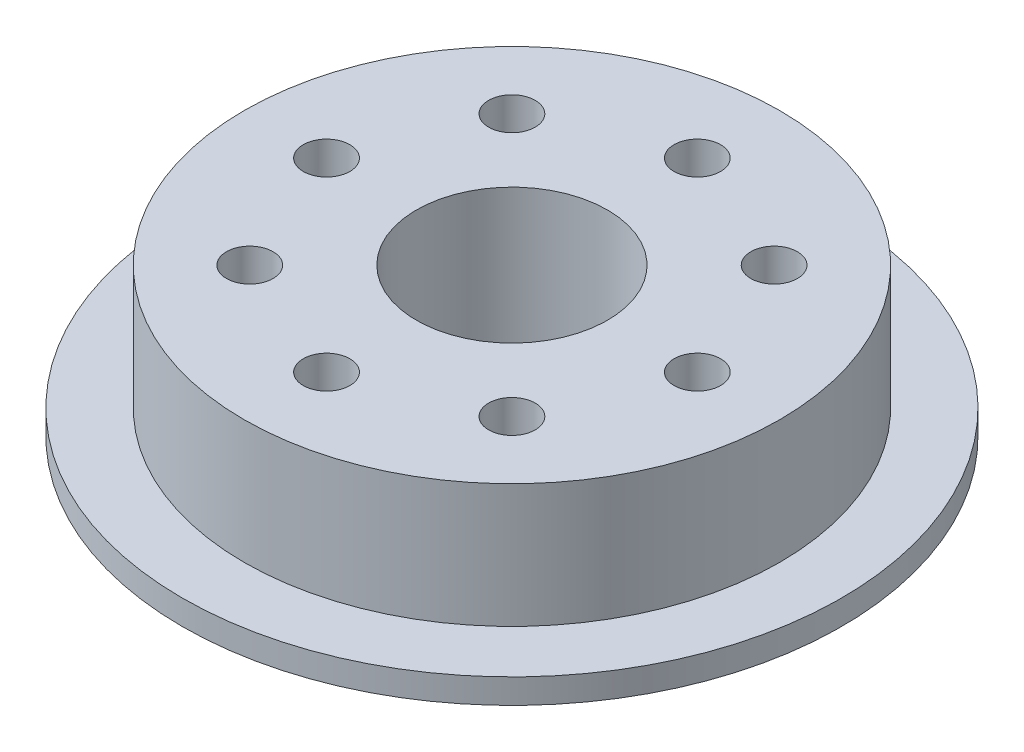
ISO-10303-21;
HEADER;
FILE_DESCRIPTION(('STEP AP214'),'2;1');
FILE_NAME('part.step','',(''),(''),'','','');
FILE_SCHEMA(('AUTOMOTIVE_DESIGN { 1 0 10303 214 1 1 1 1 }'));
ENDSEC;
DATA;
#1=APPLICATION_CONTEXT('core data for automotive mechanical design processes');
#2=APPLICATION_PROTOCOL_DEFINITION('international standard','automotive_design',2000,#1);
#3=PRODUCT_CONTEXT('',#1,'mechanical');
#4=PRODUCT('Part','Part','',(#3));
#5=PRODUCT_RELATED_PRODUCT_CATEGORY('part','',(#4));
#6=PRODUCT_DEFINITION_FORMATION('','',#4);
#7=PRODUCT_DEFINITION_CONTEXT('part definition',#1,'design');
#8=PRODUCT_DEFINITION('design','',#6,#7);
#9=PRODUCT_DEFINITION_SHAPE('','',#8);
#10=(LENGTH_UNIT() NAMED_UNIT(*) SI_UNIT(.MILLI.,.METRE.));
#11=(NAMED_UNIT(*) PLANE_ANGLE_UNIT() SI_UNIT($,.RADIAN.));
#12=(NAMED_UNIT(*) SI_UNIT($,.STERADIAN.) SOLID_ANGLE_UNIT());
#13=UNCERTAINTY_MEASURE_WITH_UNIT(LENGTH_MEASURE(1.E-05),#10,'distance_accuracy_value','');
#14=(GEOMETRIC_REPRESENTATION_CONTEXT(3) GLOBAL_UNCERTAINTY_ASSIGNED_CONTEXT((#13)) GLOBAL_UNIT_ASSIGNED_CONTEXT((#10,
#11,#12)) REPRESENTATION_CONTEXT('',''));
#15=CARTESIAN_POINT('',(0.,0.,0.));
#16=DIRECTION('',(0.,0.,1.));
#17=DIRECTION('',(1.,0.,0.));
#18=AXIS2_PLACEMENT_3D('',#15,#16,#17);
#19=CARTESIAN_POINT('',(0.,3.,0.));
#20=DIRECTION('',(0.,-1.,0.));
#21=DIRECTION('',(0.,0.,-1.));
#22=AXIS2_PLACEMENT_3D('',#19,#20,#21);
#23=CYLINDRICAL_SURFACE('',#22,40.);
#24=CARTESIAN_POINT('',(0.,3.,0.));
#25=DIRECTION('',(0.,1.,0.));
#26=DIRECTION('',(0.,0.,1.));
#27=AXIS2_PLACEMENT_3D('',#24,#25,#26);
#28=CIRCLE('',#27,40.);
#29=CARTESIAN_POINT('',(0.,3.,40.));
#30=VERTEX_POINT('',#29);
#31=EDGE_CURVE('E45',#30,#30,#28,.T.);
#32=ORIENTED_EDGE('',*,*,#31,.F.);
#33=EDGE_LOOP('',(#32));
#34=FACE_BOUND('',#33,.T.);
#35=CARTESIAN_POINT('',(0.,0.,0.));
#36=DIRECTION('',(0.,1.,0.));
#37=DIRECTION('',(0.,0.,1.));
#38=AXIS2_PLACEMENT_3D('',#35,#36,#37);
#39=CIRCLE('',#38,40.);
#40=CARTESIAN_POINT('',(0.,0.,40.));
#41=VERTEX_POINT('',#40);
#42=EDGE_CURVE('E40',#41,#41,#39,.T.);
#43=ORIENTED_EDGE('',*,*,#42,.T.);
#44=EDGE_LOOP('',(#43));
#45=FACE_BOUND('',#44,.T.);
#46=ADVANCED_FACE('F37',(#34,#45),#23,.T.);
#47=CARTESIAN_POINT('',(0.,3.,0.));
#48=DIRECTION('',(0.,1.,0.));
#49=DIRECTION('',(0.,0.,1.));
#50=AXIS2_PLACEMENT_3D('',#47,#48,#49);
#51=PLANE('',#50);
#52=CARTESIAN_POINT('',(0.,3.,0.));
#53=DIRECTION('',(0.,1.,0.));
#54=DIRECTION('',(0.,0.,1.));
#55=AXIS2_PLACEMENT_3D('',#52,#53,#54);
#56=CIRCLE('',#55,32.5);
#57=CARTESIAN_POINT('',(0.,3.,32.5));
#58=VERTEX_POINT('',#57);
#59=EDGE_CURVE('E10',#58,#58,#56,.T.);
#60=ORIENTED_EDGE('',*,*,#59,.F.);
#61=EDGE_LOOP('',(#60));
#62=FACE_BOUND('',#61,.T.);
#63=ORIENTED_EDGE('',*,*,#31,.T.);
#64=EDGE_LOOP('',(#63));
#65=FACE_BOUND('',#64,.T.);
#66=ADVANCED_FACE('F143',(#62,#65),#51,.T.);
#67=CARTESIAN_POINT('',(0.,0.,0.));
#68=DIRECTION('',(0.,1.,0.));
#69=DIRECTION('',(0.,0.,1.));
#70=AXIS2_PLACEMENT_3D('',#67,#68,#69);
#71=PLANE('',#70);
#72=CARTESIAN_POINT('',(0.,0.,0.));
#73=DIRECTION('',(0.,-1.,0.));
#74=DIRECTION('',(0.,0.,-1.));
#75=AXIS2_PLACEMENT_3D('',#72,#73,#74);
#76=CIRCLE('',#75,11.6);
#77=CARTESIAN_POINT('',(0.,0.,-11.6));
#78=VERTEX_POINT('',#77);
#79=EDGE_CURVE('E121',#78,#78,#76,.T.);
#80=ORIENTED_EDGE('',*,*,#79,.F.);
#81=EDGE_LOOP('',(#80));
#82=FACE_BOUND('',#81,.T.);
#83=CARTESIAN_POINT('',(0.,0.,-22.5));
#84=DIRECTION('',(0.,1.,0.));
#85=DIRECTION('',(0.,0.,1.));
#86=AXIS2_PLACEMENT_3D('',#83,#84,#85);
#87=CIRCLE('',#86,2.82527211998959);
#88=CARTESIAN_POINT('',(0.,0.,-19.6747278800104));
#89=VERTEX_POINT('',#88);
#90=EDGE_CURVE('E56',#89,#89,#87,.T.);
#91=ORIENTED_EDGE('',*,*,#90,.T.);
#92=EDGE_LOOP('',(#91));
#93=FACE_BOUND('',#92,.T.);
#94=CARTESIAN_POINT('',(15.9099025766976,0.,-15.909902576698));
#95=DIRECTION('',(0.,1.,0.));
#96=DIRECTION('',(0.,0.,1.));
#97=AXIS2_PLACEMENT_3D('',#94,#95,#96);
#98=CIRCLE('',#97,2.8252721199897);
#99=CARTESIAN_POINT('',(15.9099025766976,0.,-13.0846304567083));
#100=VERTEX_POINT('',#99);
#101=EDGE_CURVE('E110',#100,#100,#98,.T.);
#102=ORIENTED_EDGE('',*,*,#101,.T.);
#103=EDGE_LOOP('',(#102));
#104=FACE_BOUND('',#103,.T.);
#105=CARTESIAN_POINT('',(22.500000000001,0.,-9.55099510329013E-13));
#106=DIRECTION('',(0.,1.,0.));
#107=DIRECTION('',(0.,0.,1.));
#108=AXIS2_PLACEMENT_3D('',#105,#106,#107);
#109=CIRCLE('',#108,2.8252721199903);
#110=CARTESIAN_POINT('',(22.500000000001,0.,2.82527211998935));
#111=VERTEX_POINT('',#110);
#112=EDGE_CURVE('E102',#111,#111,#109,.T.);
#113=ORIENTED_EDGE('',*,*,#112,.T.);
#114=EDGE_LOOP('',(#113));
#115=FACE_BOUND('',#114,.T.);
#116=CARTESIAN_POINT('',(15.9099025766989,0.,15.9099025766966));
#117=DIRECTION('',(0.,1.,0.));
#118=DIRECTION('',(0.,0.,1.));
#119=AXIS2_PLACEMENT_3D('',#116,#117,#118);
#120=CIRCLE('',#119,2.82527211999106);
#121=CARTESIAN_POINT('',(15.9099025766989,0.,18.7351746966877));
#122=VERTEX_POINT('',#121);
#123=EDGE_CURVE('E94',#122,#122,#120,.T.);
#124=ORIENTED_EDGE('',*,*,#123,.T.);
#125=EDGE_LOOP('',(#124));
#126=FACE_BOUND('',#125,.T.);
#127=CARTESIAN_POINT('',(1.91019902065803E-12,0.,22.5));
#128=DIRECTION('',(0.,1.,0.));
#129=DIRECTION('',(0.,0.,1.));
#130=AXIS2_PLACEMENT_3D('',#127,#128,#129);
#131=CIRCLE('',#130,2.82527211999157);
#132=CARTESIAN_POINT('',(1.91019902065803E-12,0.,25.3252721199916));
#133=VERTEX_POINT('',#132);
#134=EDGE_CURVE('E86',#133,#133,#131,.T.);
#135=ORIENTED_EDGE('',*,*,#134,.T.);
#136=EDGE_LOOP('',(#135));
#137=FACE_BOUND('',#136,.T.);
#138=CARTESIAN_POINT('',(-15.9099025766957,0.,15.909902576698));
#139=DIRECTION('',(0.,1.,0.));
#140=DIRECTION('',(0.,0.,1.));
#141=AXIS2_PLACEMENT_3D('',#138,#139,#140);
#142=CIRCLE('',#141,2.82527211999153);
#143=CARTESIAN_POINT('',(-15.9099025766957,0.,18.7351746966895));
#144=VERTEX_POINT('',#143);
#145=EDGE_CURVE('E78',#144,#144,#142,.T.);
#146=ORIENTED_EDGE('',*,*,#145,.T.);
#147=EDGE_LOOP('',(#146));
#148=FACE_BOUND('',#147,.T.);
#149=CARTESIAN_POINT('',(-22.499999999999,0.,9.57854965627095E-13));
#150=DIRECTION('',(0.,1.,0.));
#151=DIRECTION('',(0.,0.,1.));
#152=AXIS2_PLACEMENT_3D('',#149,#150,#151);
#153=CIRCLE('',#152,2.82527211999101);
#154=CARTESIAN_POINT('',(-22.499999999999,0.,2.82527211999197));
#155=VERTEX_POINT('',#154);
#156=EDGE_CURVE('E70',#155,#155,#153,.T.);
#157=ORIENTED_EDGE('',*,*,#156,.T.);
#158=EDGE_LOOP('',(#157));
#159=FACE_BOUND('',#158,.T.);
#160=CARTESIAN_POINT('',(-15.909902576697,0.,-15.9099025766966));
#161=DIRECTION('',(0.,1.,0.));
#162=DIRECTION('',(0.,0.,1.));
#163=AXIS2_PLACEMENT_3D('',#160,#161,#162);
#164=CIRCLE('',#163,2.82527211999032);
#165=CARTESIAN_POINT('',(-15.909902576697,0.,-13.0846304567063));
#166=VERTEX_POINT('',#165);
#167=EDGE_CURVE('E61',#166,#166,#164,.T.);
#168=ORIENTED_EDGE('',*,*,#167,.T.);
#169=EDGE_LOOP('',(#168));
#170=FACE_BOUND('',#169,.T.);
#171=ORIENTED_EDGE('',*,*,#42,.F.);
#172=EDGE_LOOP('',(#171));
#173=FACE_BOUND('',#172,.T.);
#174=ADVANCED_FACE('F139',(#82,#93,#104,#115,#126,#137,#148,#159,#170,#173),#71,.F.);
#175=CARTESIAN_POINT('',(0.,18.,0.));
#176=DIRECTION('',(0.,-1.,0.));
#177=DIRECTION('',(0.,0.,-1.));
#178=AXIS2_PLACEMENT_3D('',#175,#176,#177);
#179=CYLINDRICAL_SURFACE('',#178,32.5);
#180=CARTESIAN_POINT('',(0.,18.,0.));
#181=DIRECTION('',(0.,1.,0.));
#182=DIRECTION('',(0.,0.,1.));
#183=AXIS2_PLACEMENT_3D('',#180,#181,#182);
#184=CIRCLE('',#183,32.5);
#185=CARTESIAN_POINT('',(0.,18.,32.5));
#186=VERTEX_POINT('',#185);
#187=EDGE_CURVE('E52',#186,#186,#184,.T.);
#188=ORIENTED_EDGE('',*,*,#187,.F.);
#189=EDGE_LOOP('',(#188));
#190=FACE_BOUND('',#189,.T.);
#191=ORIENTED_EDGE('',*,*,#59,.T.);
#192=EDGE_LOOP('',(#191));
#193=FACE_BOUND('',#192,.T.);
#194=ADVANCED_FACE('F142',(#190,#193),#179,.T.);
#195=CARTESIAN_POINT('',(0.,18.,0.));
#196=DIRECTION('',(0.,1.,0.));
#197=DIRECTION('',(0.,0.,1.));
#198=AXIS2_PLACEMENT_3D('',#195,#196,#197);
#199=PLANE('',#198);
#200=CARTESIAN_POINT('',(0.,18.,0.));
#201=DIRECTION('',(0.,-1.,0.));
#202=DIRECTION('',(0.,0.,-1.));
#203=AXIS2_PLACEMENT_3D('',#200,#201,#202);
#204=CIRCLE('',#203,11.6);
#205=CARTESIAN_POINT('',(0.,18.,-11.6));
#206=VERTEX_POINT('',#205);
#207=EDGE_CURVE('E62',#206,#206,#204,.T.);
#208=ORIENTED_EDGE('',*,*,#207,.T.);
#209=EDGE_LOOP('',(#208));
#210=FACE_BOUND('',#209,.T.);
#211=CARTESIAN_POINT('',(0.,18.,-22.5));
#212=DIRECTION('',(0.,1.,0.));
#213=DIRECTION('',(0.,0.,1.));
#214=AXIS2_PLACEMENT_3D('',#211,#212,#213);
#215=CIRCLE('',#214,2.82527211998959);
#216=CARTESIAN_POINT('',(0.,18.,-19.6747278800104));
#217=VERTEX_POINT('',#216);
#218=EDGE_CURVE('E114',#217,#217,#215,.T.);
#219=ORIENTED_EDGE('',*,*,#218,.F.);
#220=EDGE_LOOP('',(#219));
#221=FACE_BOUND('',#220,.T.);
#222=CARTESIAN_POINT('',(15.9099025766976,18.,-15.909902576698));
#223=DIRECTION('',(0.,1.,0.));
#224=DIRECTION('',(0.,0.,1.));
#225=AXIS2_PLACEMENT_3D('',#222,#223,#224);
#226=CIRCLE('',#225,2.8252721199897);
#227=CARTESIAN_POINT('',(15.9099025766976,18.,-13.0846304567083));
#228=VERTEX_POINT('',#227);
#229=EDGE_CURVE('E106',#228,#228,#226,.T.);
#230=ORIENTED_EDGE('',*,*,#229,.F.);
#231=EDGE_LOOP('',(#230));
#232=FACE_BOUND('',#231,.T.);
#233=CARTESIAN_POINT('',(22.500000000001,18.,-9.55099510329013E-13));
#234=DIRECTION('',(0.,1.,0.));
#235=DIRECTION('',(0.,0.,1.));
#236=AXIS2_PLACEMENT_3D('',#233,#234,#235);
#237=CIRCLE('',#236,2.8252721199903);
#238=CARTESIAN_POINT('',(22.500000000001,18.,2.82527211998935));
#239=VERTEX_POINT('',#238);
#240=EDGE_CURVE('E98',#239,#239,#237,.T.);
#241=ORIENTED_EDGE('',*,*,#240,.F.);
#242=EDGE_LOOP('',(#241));
#243=FACE_BOUND('',#242,.T.);
#244=CARTESIAN_POINT('',(15.9099025766989,18.,15.9099025766966));
#245=DIRECTION('',(0.,1.,0.));
#246=DIRECTION('',(0.,0.,1.));
#247=AXIS2_PLACEMENT_3D('',#244,#245,#246);
#248=CIRCLE('',#247,2.82527211999106);
#249=CARTESIAN_POINT('',(15.9099025766989,18.,18.7351746966877));
#250=VERTEX_POINT('',#249);
#251=EDGE_CURVE('E90',#250,#250,#248,.T.);
#252=ORIENTED_EDGE('',*,*,#251,.F.);
#253=EDGE_LOOP('',(#252));
#254=FACE_BOUND('',#253,.T.);
#255=CARTESIAN_POINT('',(1.91019902065803E-12,18.,22.5));
#256=DIRECTION('',(0.,1.,0.));
#257=DIRECTION('',(0.,0.,1.));
#258=AXIS2_PLACEMENT_3D('',#255,#256,#257);
#259=CIRCLE('',#258,2.82527211999157);
#260=CARTESIAN_POINT('',(1.91019902065803E-12,18.,25.3252721199916));
#261=VERTEX_POINT('',#260);
#262=EDGE_CURVE('E82',#261,#261,#259,.T.);
#263=ORIENTED_EDGE('',*,*,#262,.F.);
#264=EDGE_LOOP('',(#263));
#265=FACE_BOUND('',#264,.T.);
#266=CARTESIAN_POINT('',(-15.9099025766957,18.,15.909902576698));
#267=DIRECTION('',(0.,1.,0.));
#268=DIRECTION('',(0.,0.,1.));
#269=AXIS2_PLACEMENT_3D('',#266,#267,#268);
#270=CIRCLE('',#269,2.82527211999153);
#271=CARTESIAN_POINT('',(-15.9099025766957,18.,18.7351746966895));
#272=VERTEX_POINT('',#271);
#273=EDGE_CURVE('E74',#272,#272,#270,.T.);
#274=ORIENTED_EDGE('',*,*,#273,.F.);
#275=EDGE_LOOP('',(#274));
#276=FACE_BOUND('',#275,.T.);
#277=CARTESIAN_POINT('',(-22.499999999999,18.,9.57854965627095E-13));
#278=DIRECTION('',(0.,1.,0.));
#279=DIRECTION('',(0.,0.,1.));
#280=AXIS2_PLACEMENT_3D('',#277,#278,#279);
#281=CIRCLE('',#280,2.82527211999101);
#282=CARTESIAN_POINT('',(-22.499999999999,18.,2.82527211999197));
#283=VERTEX_POINT('',#282);
#284=EDGE_CURVE('E66',#283,#283,#281,.T.);
#285=ORIENTED_EDGE('',*,*,#284,.F.);
#286=EDGE_LOOP('',(#285));
#287=FACE_BOUND('',#286,.T.);
#288=CARTESIAN_POINT('',(-15.909902576697,18.,-15.9099025766966));
#289=DIRECTION('',(0.,1.,0.));
#290=DIRECTION('',(0.,0.,1.));
#291=AXIS2_PLACEMENT_3D('',#288,#289,#290);
#292=CIRCLE('',#291,2.82527211999032);
#293=CARTESIAN_POINT('',(-15.909902576697,18.,-13.0846304567063));
#294=VERTEX_POINT('',#293);
#295=EDGE_CURVE('E57',#294,#294,#292,.T.);
#296=ORIENTED_EDGE('',*,*,#295,.F.);
#297=EDGE_LOOP('',(#296));
#298=FACE_BOUND('',#297,.T.);
#299=ORIENTED_EDGE('',*,*,#187,.T.);
#300=EDGE_LOOP('',(#299));
#301=FACE_BOUND('',#300,.T.);
#302=ADVANCED_FACE('F129',(#210,#221,#232,#243,#254,#265,#276,#287,#298,#301),#199,.T.);
#303=CARTESIAN_POINT('',(-15.909902576697,0.,-15.9099025766966));
#304=DIRECTION('',(0.,1.,0.));
#305=DIRECTION('',(0.,0.,1.));
#306=AXIS2_PLACEMENT_3D('',#303,#304,#305);
#307=CYLINDRICAL_SURFACE('',#306,2.82527211999032);
#308=ORIENTED_EDGE('',*,*,#167,.F.);
#309=EDGE_LOOP('',(#308));
#310=FACE_BOUND('',#309,.T.);
#311=ORIENTED_EDGE('',*,*,#295,.T.);
#312=EDGE_LOOP('',(#311));
#313=FACE_BOUND('',#312,.T.);
#314=ADVANCED_FACE('F181',(#310,#313),#307,.F.);
#315=CARTESIAN_POINT('',(-22.499999999999,0.,9.57854965627095E-13));
#316=DIRECTION('',(0.,1.,0.));
#317=DIRECTION('',(0.,0.,1.));
#318=AXIS2_PLACEMENT_3D('',#315,#316,#317);
#319=CYLINDRICAL_SURFACE('',#318,2.82527211999101);
#320=ORIENTED_EDGE('',*,*,#156,.F.);
#321=EDGE_LOOP('',(#320));
#322=FACE_BOUND('',#321,.T.);
#323=ORIENTED_EDGE('',*,*,#284,.T.);
#324=EDGE_LOOP('',(#323));
#325=FACE_BOUND('',#324,.T.);
#326=ADVANCED_FACE('F184',(#322,#325),#319,.F.);
#327=CARTESIAN_POINT('',(-15.9099025766957,0.,15.909902576698));
#328=DIRECTION('',(0.,1.,0.));
#329=DIRECTION('',(0.,0.,1.));
#330=AXIS2_PLACEMENT_3D('',#327,#328,#329);
#331=CYLINDRICAL_SURFACE('',#330,2.82527211999153);
#332=ORIENTED_EDGE('',*,*,#145,.F.);
#333=EDGE_LOOP('',(#332));
#334=FACE_BOUND('',#333,.T.);
#335=ORIENTED_EDGE('',*,*,#273,.T.);
#336=EDGE_LOOP('',(#335));
#337=FACE_BOUND('',#336,.T.);
#338=ADVANCED_FACE('F188',(#334,#337),#331,.F.);
#339=CARTESIAN_POINT('',(1.91019902065803E-12,0.,22.5));
#340=DIRECTION('',(0.,1.,0.));
#341=DIRECTION('',(0.,0.,1.));
#342=AXIS2_PLACEMENT_3D('',#339,#340,#341);
#343=CYLINDRICAL_SURFACE('',#342,2.82527211999157);
#344=ORIENTED_EDGE('',*,*,#134,.F.);
#345=EDGE_LOOP('',(#344));
#346=FACE_BOUND('',#345,.T.);
#347=ORIENTED_EDGE('',*,*,#262,.T.);
#348=EDGE_LOOP('',(#347));
#349=FACE_BOUND('',#348,.T.);
#350=ADVANCED_FACE('F192',(#346,#349),#343,.F.);
#351=CARTESIAN_POINT('',(15.9099025766989,0.,15.9099025766966));
#352=DIRECTION('',(0.,1.,0.));
#353=DIRECTION('',(0.,0.,1.));
#354=AXIS2_PLACEMENT_3D('',#351,#352,#353);
#355=CYLINDRICAL_SURFACE('',#354,2.82527211999106);
#356=ORIENTED_EDGE('',*,*,#123,.F.);
#357=EDGE_LOOP('',(#356));
#358=FACE_BOUND('',#357,.T.);
#359=ORIENTED_EDGE('',*,*,#251,.T.);
#360=EDGE_LOOP('',(#359));
#361=FACE_BOUND('',#360,.T.);
#362=ADVANCED_FACE('F196',(#358,#361),#355,.F.);
#363=CARTESIAN_POINT('',(22.500000000001,0.,-9.55099510329013E-13));
#364=DIRECTION('',(0.,1.,0.));
#365=DIRECTION('',(0.,0.,1.));
#366=AXIS2_PLACEMENT_3D('',#363,#364,#365);
#367=CYLINDRICAL_SURFACE('',#366,2.8252721199903);
#368=ORIENTED_EDGE('',*,*,#112,.F.);
#369=EDGE_LOOP('',(#368));
#370=FACE_BOUND('',#369,.T.);
#371=ORIENTED_EDGE('',*,*,#240,.T.);
#372=EDGE_LOOP('',(#371));
#373=FACE_BOUND('',#372,.T.);
#374=ADVANCED_FACE('F200',(#370,#373),#367,.F.);
#375=CARTESIAN_POINT('',(15.9099025766976,0.,-15.909902576698));
#376=DIRECTION('',(0.,1.,0.));
#377=DIRECTION('',(0.,0.,1.));
#378=AXIS2_PLACEMENT_3D('',#375,#376,#377);
#379=CYLINDRICAL_SURFACE('',#378,2.8252721199897);
#380=ORIENTED_EDGE('',*,*,#101,.F.);
#381=EDGE_LOOP('',(#380));
#382=FACE_BOUND('',#381,.T.);
#383=ORIENTED_EDGE('',*,*,#229,.T.);
#384=EDGE_LOOP('',(#383));
#385=FACE_BOUND('',#384,.T.);
#386=ADVANCED_FACE('F204',(#382,#385),#379,.F.);
#387=CARTESIAN_POINT('',(0.,0.,-22.5));
#388=DIRECTION('',(0.,1.,0.));
#389=DIRECTION('',(0.,0.,1.));
#390=AXIS2_PLACEMENT_3D('',#387,#388,#389);
#391=CYLINDRICAL_SURFACE('',#390,2.82527211998959);
#392=ORIENTED_EDGE('',*,*,#90,.F.);
#393=EDGE_LOOP('',(#392));
#394=FACE_BOUND('',#393,.T.);
#395=ORIENTED_EDGE('',*,*,#218,.T.);
#396=EDGE_LOOP('',(#395));
#397=FACE_BOUND('',#396,.T.);
#398=ADVANCED_FACE('F135',(#394,#397),#391,.F.);
#399=CARTESIAN_POINT('',(0.,18.,0.));
#400=DIRECTION('',(0.,-1.,0.));
#401=DIRECTION('',(0.,0.,-1.));
#402=AXIS2_PLACEMENT_3D('',#399,#400,#401);
#403=CYLINDRICAL_SURFACE('',#402,11.6);
#404=ORIENTED_EDGE('',*,*,#207,.F.);
#405=EDGE_LOOP('',(#404));
#406=FACE_BOUND('',#405,.T.);
#407=ORIENTED_EDGE('',*,*,#79,.T.);
#408=EDGE_LOOP('',(#407));
#409=FACE_BOUND('',#408,.T.);
#410=ADVANCED_FACE('F132',(#406,#409),#403,.F.);
#411=CLOSED_SHELL('',(#46,#66,#174,#194,#302,#314,#326,#338,#350,#362,#374,#386,#398,#410));
#412=MANIFOLD_SOLID_BREP('B2',#411);
#413=ADVANCED_BREP_SHAPE_REPRESENTATION('',(#18,#412),#14);
#414=SHAPE_DEFINITION_REPRESENTATION(#9,#413);
ENDSEC;
END-ISO-10303-21;
